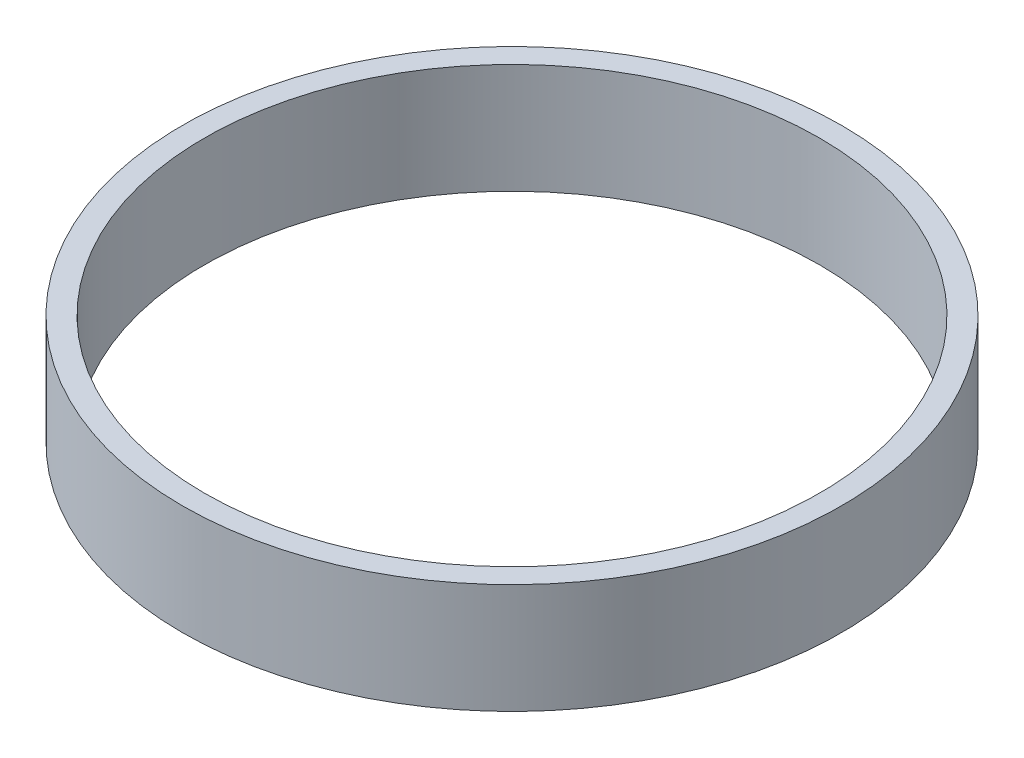
ISO-10303-21;
HEADER;
FILE_DESCRIPTION(('STEP AP214'),'2;1');
FILE_NAME('part.step','',(''),(''),'','','');
FILE_SCHEMA(('AUTOMOTIVE_DESIGN { 1 0 10303 214 1 1 1 1 }'));
ENDSEC;
DATA;
#1=APPLICATION_CONTEXT('core data for automotive mechanical design processes');
#2=APPLICATION_PROTOCOL_DEFINITION('international standard','automotive_design',2000,#1);
#3=PRODUCT_CONTEXT('',#1,'mechanical');
#4=PRODUCT('Part','Part','',(#3));
#5=PRODUCT_RELATED_PRODUCT_CATEGORY('part','',(#4));
#6=PRODUCT_DEFINITION_FORMATION('','',#4);
#7=PRODUCT_DEFINITION_CONTEXT('part definition',#1,'design');
#8=PRODUCT_DEFINITION('design','',#6,#7);
#9=PRODUCT_DEFINITION_SHAPE('','',#8);
#10=(LENGTH_UNIT() NAMED_UNIT(*) SI_UNIT(.MILLI.,.METRE.));
#11=(NAMED_UNIT(*) PLANE_ANGLE_UNIT() SI_UNIT($,.RADIAN.));
#12=(NAMED_UNIT(*) SI_UNIT($,.STERADIAN.) SOLID_ANGLE_UNIT());
#13=UNCERTAINTY_MEASURE_WITH_UNIT(LENGTH_MEASURE(1.E-05),#10,'distance_accuracy_value','');
#14=(GEOMETRIC_REPRESENTATION_CONTEXT(3) GLOBAL_UNCERTAINTY_ASSIGNED_CONTEXT((#13)) GLOBAL_UNIT_ASSIGNED_CONTEXT((#10,
#11,#12)) REPRESENTATION_CONTEXT('',''));
#15=CARTESIAN_POINT('',(0.,0.,0.));
#16=DIRECTION('',(0.,0.,1.));
#17=DIRECTION('',(1.,0.,0.));
#18=AXIS2_PLACEMENT_3D('',#15,#16,#17);
#19=CARTESIAN_POINT('',(0.,10.,0.));
#20=DIRECTION('',(0.,1.,0.));
#21=DIRECTION('',(0.,0.,1.));
#22=AXIS2_PLACEMENT_3D('',#19,#20,#21);
#23=PLANE('',#22);
#24=CARTESIAN_POINT('',(0.,10.,0.));
#25=DIRECTION('',(0.,1.,0.));
#26=DIRECTION('',(0.,0.,1.));
#27=AXIS2_PLACEMENT_3D('',#24,#25,#26);
#28=CIRCLE('',#27,30.);
#29=CARTESIAN_POINT('',(0.,10.,30.));
#30=VERTEX_POINT('',#29);
#31=EDGE_CURVE('E10',#30,#30,#28,.T.);
#32=ORIENTED_EDGE('',*,*,#31,.T.);
#33=EDGE_LOOP('',(#32));
#34=FACE_BOUND('',#33,.T.);
#35=CARTESIAN_POINT('',(0.,10.,0.));
#36=DIRECTION('',(0.,1.,0.));
#37=DIRECTION('',(0.,0.,1.));
#38=AXIS2_PLACEMENT_3D('',#35,#36,#37);
#39=CIRCLE('',#38,28.);
#40=CARTESIAN_POINT('',(0.,10.,28.));
#41=VERTEX_POINT('',#40);
#42=EDGE_CURVE('E46',#41,#41,#39,.T.);
#43=ORIENTED_EDGE('',*,*,#42,.F.);
#44=EDGE_LOOP('',(#43));
#45=FACE_BOUND('',#44,.T.);
#46=ADVANCED_FACE('F35',(#34,#45),#23,.T.);
#47=CARTESIAN_POINT('',(0.,0.,0.));
#48=DIRECTION('',(0.,1.,0.));
#49=DIRECTION('',(0.,0.,1.));
#50=AXIS2_PLACEMENT_3D('',#47,#48,#49);
#51=PLANE('',#50);
#52=CARTESIAN_POINT('',(0.,0.,0.));
#53=DIRECTION('',(0.,1.,0.));
#54=DIRECTION('',(0.,0.,1.));
#55=AXIS2_PLACEMENT_3D('',#52,#53,#54);
#56=CIRCLE('',#55,30.);
#57=CARTESIAN_POINT('',(0.,0.,30.));
#58=VERTEX_POINT('',#57);
#59=EDGE_CURVE('E39',#58,#58,#56,.T.);
#60=ORIENTED_EDGE('',*,*,#59,.F.);
#61=EDGE_LOOP('',(#60));
#62=FACE_BOUND('',#61,.T.);
#63=CARTESIAN_POINT('',(0.,0.,0.));
#64=DIRECTION('',(0.,1.,0.));
#65=DIRECTION('',(0.,0.,1.));
#66=AXIS2_PLACEMENT_3D('',#63,#64,#65);
#67=CIRCLE('',#66,28.);
#68=CARTESIAN_POINT('',(0.,0.,28.));
#69=VERTEX_POINT('',#68);
#70=EDGE_CURVE('E48',#69,#69,#67,.T.);
#71=ORIENTED_EDGE('',*,*,#70,.T.);
#72=EDGE_LOOP('',(#71));
#73=FACE_BOUND('',#72,.T.);
#74=ADVANCED_FACE('F58',(#62,#73),#51,.F.);
#75=CARTESIAN_POINT('',(0.,10.,0.));
#76=DIRECTION('',(0.,-1.,0.));
#77=DIRECTION('',(0.,0.,-1.));
#78=AXIS2_PLACEMENT_3D('',#75,#76,#77);
#79=CYLINDRICAL_SURFACE('',#78,30.);
#80=ORIENTED_EDGE('',*,*,#31,.F.);
#81=EDGE_LOOP('',(#80));
#82=FACE_BOUND('',#81,.T.);
#83=ORIENTED_EDGE('',*,*,#59,.T.);
#84=EDGE_LOOP('',(#83));
#85=FACE_BOUND('',#84,.T.);
#86=ADVANCED_FACE('F37',(#82,#85),#79,.T.);
#87=CARTESIAN_POINT('',(0.,10.,0.));
#88=DIRECTION('',(0.,-1.,0.));
#89=DIRECTION('',(0.,0.,-1.));
#90=AXIS2_PLACEMENT_3D('',#87,#88,#89);
#91=CYLINDRICAL_SURFACE('',#90,28.);
#92=ORIENTED_EDGE('',*,*,#42,.T.);
#93=EDGE_LOOP('',(#92));
#94=FACE_BOUND('',#93,.T.);
#95=ORIENTED_EDGE('',*,*,#70,.F.);
#96=EDGE_LOOP('',(#95));
#97=FACE_BOUND('',#96,.T.);
#98=ADVANCED_FACE('F54',(#94,#97),#91,.F.);
#99=CLOSED_SHELL('',(#46,#74,#86,#98));
#100=MANIFOLD_SOLID_BREP('B2',#99);
#101=ADVANCED_BREP_SHAPE_REPRESENTATION('',(#18,#100),#14);
#102=SHAPE_DEFINITION_REPRESENTATION(#9,#101);
ENDSEC;
END-ISO-10303-21;
